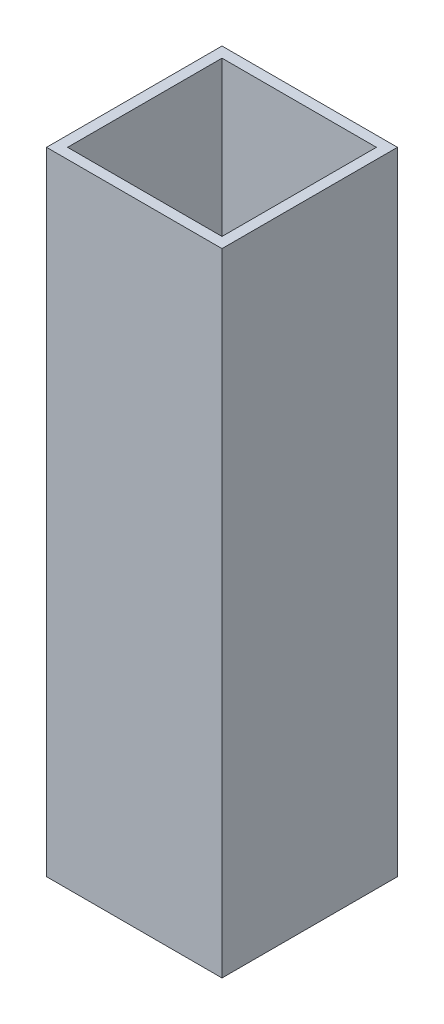
ISO-10303-21;
HEADER;
FILE_DESCRIPTION(('STEP AP214'),'2;1');
FILE_NAME('part.step','',(''),(''),'','','');
FILE_SCHEMA(('AUTOMOTIVE_DESIGN { 1 0 10303 214 1 1 1 1 }'));
ENDSEC;
DATA;
#1=APPLICATION_CONTEXT('core data for automotive mechanical design processes');
#2=APPLICATION_PROTOCOL_DEFINITION('international standard','automotive_design',2000,#1);
#3=PRODUCT_CONTEXT('',#1,'mechanical');
#4=PRODUCT('Part','Part','',(#3));
#5=PRODUCT_RELATED_PRODUCT_CATEGORY('part','',(#4));
#6=PRODUCT_DEFINITION_FORMATION('','',#4);
#7=PRODUCT_DEFINITION_CONTEXT('part definition',#1,'design');
#8=PRODUCT_DEFINITION('design','',#6,#7);
#9=PRODUCT_DEFINITION_SHAPE('','',#8);
#10=(LENGTH_UNIT() NAMED_UNIT(*) SI_UNIT(.MILLI.,.METRE.));
#11=(NAMED_UNIT(*) PLANE_ANGLE_UNIT() SI_UNIT($,.RADIAN.));
#12=(NAMED_UNIT(*) SI_UNIT($,.STERADIAN.) SOLID_ANGLE_UNIT());
#13=UNCERTAINTY_MEASURE_WITH_UNIT(LENGTH_MEASURE(1.E-05),#10,'distance_accuracy_value','');
#14=(GEOMETRIC_REPRESENTATION_CONTEXT(3) GLOBAL_UNCERTAINTY_ASSIGNED_CONTEXT((#13)) GLOBAL_UNIT_ASSIGNED_CONTEXT((#10,
#11,#12)) REPRESENTATION_CONTEXT('',''));
#15=CARTESIAN_POINT('',(0.,0.,0.));
#16=DIRECTION('',(0.,0.,1.));
#17=DIRECTION('',(1.,0.,0.));
#18=AXIS2_PLACEMENT_3D('',#15,#16,#17);
#19=CARTESIAN_POINT('',(-21.0084033613445,45.,-3.09873949579832));
#20=DIRECTION('',(1.,0.,0.));
#21=DIRECTION('',(0.,0.,-1.));
#22=AXIS2_PLACEMENT_3D('',#19,#20,#21);
#23=PLANE('',#22);
#24=DIRECTION('',(0.,0.,1.));
#25=VECTOR('',#24,1.);
#26=CARTESIAN_POINT('',(-21.0084033613445,0.,-3.09873949579832));
#27=LINE('',#26,#25);
#28=CARTESIAN_POINT('',(-21.0084033613445,0.,-3.09873949579832));
#29=VERTEX_POINT('',#28);
#30=CARTESIAN_POINT('',(-21.0084033613445,0.,9.40126050420168));
#31=VERTEX_POINT('',#30);
#32=EDGE_CURVE('E142',#29,#31,#27,.T.);
#33=ORIENTED_EDGE('',*,*,#32,.T.);
#34=DIRECTION('',(0.,-1.,0.));
#35=VECTOR('',#34,1.);
#36=CARTESIAN_POINT('',(-21.0084033613445,45.,9.40126050420168));
#37=LINE('',#36,#35);
#38=CARTESIAN_POINT('',(-21.0084033613445,45.,9.40126050420168));
#39=VERTEX_POINT('',#38);
#40=EDGE_CURVE('E11',#39,#31,#37,.T.);
#41=ORIENTED_EDGE('',*,*,#40,.F.);
#42=DIRECTION('',(0.,0.,1.));
#43=VECTOR('',#42,1.);
#44=CARTESIAN_POINT('',(-21.0084033613445,45.,-3.09873949579832));
#45=LINE('',#44,#43);
#46=CARTESIAN_POINT('',(-21.0084033613445,45.,-3.09873949579832));
#47=VERTEX_POINT('',#46);
#48=EDGE_CURVE('E146',#47,#39,#45,.T.);
#49=ORIENTED_EDGE('',*,*,#48,.F.);
#50=DIRECTION('',(0.,-1.,0.));
#51=VECTOR('',#50,1.);
#52=CARTESIAN_POINT('',(-21.0084033613445,45.,-3.09873949579832));
#53=LINE('',#52,#51);
#54=EDGE_CURVE('E152',#47,#29,#53,.T.);
#55=ORIENTED_EDGE('',*,*,#54,.T.);
#56=EDGE_LOOP('',(#33,#41,#49,#55));
#57=FACE_BOUND('',#56,.T.);
#58=ADVANCED_FACE('F34',(#57),#23,.F.);
#59=CARTESIAN_POINT('',(-21.0084033613445,45.,9.40126050420168));
#60=DIRECTION('',(0.,0.,-1.));
#61=DIRECTION('',(-1.,0.,0.));
#62=AXIS2_PLACEMENT_3D('',#59,#60,#61);
#63=PLANE('',#62);
#64=DIRECTION('',(1.,0.,0.));
#65=VECTOR('',#64,1.);
#66=CARTESIAN_POINT('',(-21.0084033613445,0.,9.40126050420168));
#67=LINE('',#66,#65);
#68=CARTESIAN_POINT('',(-8.50840336134454,0.,9.40126050420168));
#69=VERTEX_POINT('',#68);
#70=EDGE_CURVE('E155',#31,#69,#67,.T.);
#71=ORIENTED_EDGE('',*,*,#70,.T.);
#72=DIRECTION('',(0.,-1.,0.));
#73=VECTOR('',#72,1.);
#74=CARTESIAN_POINT('',(-8.50840336134454,45.,9.40126050420168));
#75=LINE('',#74,#73);
#76=CARTESIAN_POINT('',(-8.50840336134454,45.,9.40126050420168));
#77=VERTEX_POINT('',#76);
#78=EDGE_CURVE('E41',#77,#69,#75,.T.);
#79=ORIENTED_EDGE('',*,*,#78,.F.);
#80=DIRECTION('',(1.,0.,0.));
#81=VECTOR('',#80,1.);
#82=CARTESIAN_POINT('',(-21.0084033613445,45.,9.40126050420168));
#83=LINE('',#82,#81);
#84=EDGE_CURVE('E85',#39,#77,#83,.T.);
#85=ORIENTED_EDGE('',*,*,#84,.F.);
#86=ORIENTED_EDGE('',*,*,#40,.T.);
#87=EDGE_LOOP('',(#71,#79,#85,#86));
#88=FACE_BOUND('',#87,.T.);
#89=ADVANCED_FACE('F184',(#88),#63,.F.);
#90=CARTESIAN_POINT('',(-8.50840336134454,45.,-3.09873949579832));
#91=DIRECTION('',(-1.,0.,0.));
#92=DIRECTION('',(0.,0.,1.));
#93=AXIS2_PLACEMENT_3D('',#90,#91,#92);
#94=PLANE('',#93);
#95=DIRECTION('',(0.,0.,-1.));
#96=VECTOR('',#95,1.);
#97=CARTESIAN_POINT('',(-8.50840336134454,0.,-3.09873949579832));
#98=LINE('',#97,#96);
#99=CARTESIAN_POINT('',(-8.50840336134454,0.,-3.09873949579832));
#100=VERTEX_POINT('',#99);
#101=EDGE_CURVE('E157',#69,#100,#98,.T.);
#102=ORIENTED_EDGE('',*,*,#101,.T.);
#103=DIRECTION('',(0.,-1.,0.));
#104=VECTOR('',#103,1.);
#105=CARTESIAN_POINT('',(-8.50840336134454,45.,-3.09873949579832));
#106=LINE('',#105,#104);
#107=CARTESIAN_POINT('',(-8.50840336134454,45.,-3.09873949579832));
#108=VERTEX_POINT('',#107);
#109=EDGE_CURVE('E161',#108,#100,#106,.T.);
#110=ORIENTED_EDGE('',*,*,#109,.F.);
#111=DIRECTION('',(0.,0.,-1.));
#112=VECTOR('',#111,1.);
#113=CARTESIAN_POINT('',(-8.50840336134454,45.,-3.09873949579832));
#114=LINE('',#113,#112);
#115=EDGE_CURVE('E149',#77,#108,#114,.T.);
#116=ORIENTED_EDGE('',*,*,#115,.F.);
#117=ORIENTED_EDGE('',*,*,#78,.T.);
#118=EDGE_LOOP('',(#102,#110,#116,#117));
#119=FACE_BOUND('',#118,.T.);
#120=ADVANCED_FACE('F166',(#119),#94,.F.);
#121=CARTESIAN_POINT('',(-21.0084033613445,45.,-3.09873949579832));
#122=DIRECTION('',(0.,0.,1.));
#123=DIRECTION('',(1.,0.,0.));
#124=AXIS2_PLACEMENT_3D('',#121,#122,#123);
#125=PLANE('',#124);
#126=DIRECTION('',(-1.,0.,0.));
#127=VECTOR('',#126,1.);
#128=CARTESIAN_POINT('',(-21.0084033613445,0.,-3.09873949579832));
#129=LINE('',#128,#127);
#130=EDGE_CURVE('E78',#100,#29,#129,.T.);
#131=ORIENTED_EDGE('',*,*,#130,.T.);
#132=ORIENTED_EDGE('',*,*,#54,.F.);
#133=DIRECTION('',(-1.,0.,0.));
#134=VECTOR('',#133,1.);
#135=CARTESIAN_POINT('',(-21.0084033613445,45.,-3.09873949579832));
#136=LINE('',#135,#134);
#137=EDGE_CURVE('E57',#108,#47,#136,.T.);
#138=ORIENTED_EDGE('',*,*,#137,.F.);
#139=ORIENTED_EDGE('',*,*,#109,.T.);
#140=EDGE_LOOP('',(#131,#132,#138,#139));
#141=FACE_BOUND('',#140,.T.);
#142=ADVANCED_FACE('F174',(#141),#125,.F.);
#143=CARTESIAN_POINT('',(0.,45.,0.));
#144=DIRECTION('',(0.,1.,0.));
#145=DIRECTION('',(0.,0.,1.));
#146=AXIS2_PLACEMENT_3D('',#143,#144,#145);
#147=PLANE('',#146);
#148=DIRECTION('',(0.,0.,1.));
#149=VECTOR('',#148,1.);
#150=CARTESIAN_POINT('',(-20.2584033613445,45.,-2.34873949579832));
#151=LINE('',#150,#149);
#152=CARTESIAN_POINT('',(-20.2584033613445,45.,-2.34873949579832));
#153=VERTEX_POINT('',#152);
#154=CARTESIAN_POINT('',(-20.2584033613445,45.,8.65126050420168));
#155=VERTEX_POINT('',#154);
#156=EDGE_CURVE('E48',#153,#155,#151,.T.);
#157=ORIENTED_EDGE('',*,*,#156,.F.);
#158=DIRECTION('',(-1.,0.,0.));
#159=VECTOR('',#158,1.);
#160=CARTESIAN_POINT('',(-20.2584033613445,45.,-2.34873949579832));
#161=LINE('',#160,#159);
#162=CARTESIAN_POINT('',(-9.25840336134454,45.,-2.34873949579832));
#163=VERTEX_POINT('',#162);
#164=EDGE_CURVE('E127',#163,#153,#161,.T.);
#165=ORIENTED_EDGE('',*,*,#164,.F.);
#166=DIRECTION('',(0.,0.,-1.));
#167=VECTOR('',#166,1.);
#168=CARTESIAN_POINT('',(-9.25840336134454,45.,-2.34873949579832));
#169=LINE('',#168,#167);
#170=CARTESIAN_POINT('',(-9.25840336134454,45.,8.65126050420168));
#171=VERTEX_POINT('',#170);
#172=EDGE_CURVE('E130',#171,#163,#169,.T.);
#173=ORIENTED_EDGE('',*,*,#172,.F.);
#174=DIRECTION('',(1.,0.,0.));
#175=VECTOR('',#174,1.);
#176=CARTESIAN_POINT('',(-20.2584033613445,45.,8.65126050420168));
#177=LINE('',#176,#175);
#178=EDGE_CURVE('E136',#155,#171,#177,.T.);
#179=ORIENTED_EDGE('',*,*,#178,.F.);
#180=EDGE_LOOP('',(#157,#165,#173,#179));
#181=FACE_BOUND('',#180,.T.);
#182=ORIENTED_EDGE('',*,*,#48,.T.);
#183=ORIENTED_EDGE('',*,*,#84,.T.);
#184=ORIENTED_EDGE('',*,*,#115,.T.);
#185=ORIENTED_EDGE('',*,*,#137,.T.);
#186=EDGE_LOOP('',(#182,#183,#184,#185));
#187=FACE_BOUND('',#186,.T.);
#188=ADVANCED_FACE('F176',(#181,#187),#147,.T.);
#189=CARTESIAN_POINT('',(0.,0.,0.));
#190=DIRECTION('',(0.,1.,0.));
#191=DIRECTION('',(0.,0.,1.));
#192=AXIS2_PLACEMENT_3D('',#189,#190,#191);
#193=PLANE('',#192);
#194=ORIENTED_EDGE('',*,*,#32,.F.);
#195=ORIENTED_EDGE('',*,*,#130,.F.);
#196=ORIENTED_EDGE('',*,*,#101,.F.);
#197=ORIENTED_EDGE('',*,*,#70,.F.);
#198=EDGE_LOOP('',(#194,#195,#196,#197));
#199=FACE_BOUND('',#198,.T.);
#200=ADVANCED_FACE('F170',(#199),#193,.F.);
#201=CARTESIAN_POINT('',(-20.2584033613445,0.999999999999994,-2.34873949579832));
#202=DIRECTION('',(-1.,0.,0.));
#203=DIRECTION('',(0.,0.,1.));
#204=AXIS2_PLACEMENT_3D('',#201,#202,#203);
#205=PLANE('',#204);
#206=ORIENTED_EDGE('',*,*,#156,.T.);
#207=DIRECTION('',(0.,1.,0.));
#208=VECTOR('',#207,1.);
#209=CARTESIAN_POINT('',(-20.2584033613445,0.999999999999994,8.65126050420168));
#210=LINE('',#209,#208);
#211=CARTESIAN_POINT('',(-20.2584033613445,0.999999999999994,8.65126050420168));
#212=VERTEX_POINT('',#211);
#213=EDGE_CURVE('E105',#212,#155,#210,.T.);
#214=ORIENTED_EDGE('',*,*,#213,.F.);
#215=DIRECTION('',(0.,0.,1.));
#216=VECTOR('',#215,1.);
#217=CARTESIAN_POINT('',(-20.2584033613445,0.999999999999994,-2.34873949579832));
#218=LINE('',#217,#216);
#219=CARTESIAN_POINT('',(-20.2584033613445,0.999999999999994,-2.34873949579832));
#220=VERTEX_POINT('',#219);
#221=EDGE_CURVE('E109',#220,#212,#218,.T.);
#222=ORIENTED_EDGE('',*,*,#221,.F.);
#223=DIRECTION('',(0.,1.,0.));
#224=VECTOR('',#223,1.);
#225=CARTESIAN_POINT('',(-20.2584033613445,0.999999999999994,-2.34873949579832));
#226=LINE('',#225,#224);
#227=EDGE_CURVE('E140',#220,#153,#226,.T.);
#228=ORIENTED_EDGE('',*,*,#227,.T.);
#229=EDGE_LOOP('',(#206,#214,#222,#228));
#230=FACE_BOUND('',#229,.T.);
#231=ADVANCED_FACE('F107',(#230),#205,.F.);
#232=CARTESIAN_POINT('',(-20.2584033613445,0.999999999999994,-2.34873949579832));
#233=DIRECTION('',(0.,0.,-1.));
#234=DIRECTION('',(-1.,0.,0.));
#235=AXIS2_PLACEMENT_3D('',#232,#233,#234);
#236=PLANE('',#235);
#237=ORIENTED_EDGE('',*,*,#164,.T.);
#238=ORIENTED_EDGE('',*,*,#227,.F.);
#239=DIRECTION('',(-1.,0.,0.));
#240=VECTOR('',#239,1.);
#241=CARTESIAN_POINT('',(-20.2584033613445,0.999999999999994,-2.34873949579832));
#242=LINE('',#241,#240);
#243=CARTESIAN_POINT('',(-9.25840336134454,0.999999999999994,-2.34873949579832));
#244=VERTEX_POINT('',#243);
#245=EDGE_CURVE('E115',#244,#220,#242,.T.);
#246=ORIENTED_EDGE('',*,*,#245,.F.);
#247=DIRECTION('',(0.,1.,0.));
#248=VECTOR('',#247,1.);
#249=CARTESIAN_POINT('',(-9.25840336134454,0.999999999999994,-2.34873949579832));
#250=LINE('',#249,#248);
#251=EDGE_CURVE('E143',#244,#163,#250,.T.);
#252=ORIENTED_EDGE('',*,*,#251,.T.);
#253=EDGE_LOOP('',(#237,#238,#246,#252));
#254=FACE_BOUND('',#253,.T.);
#255=ADVANCED_FACE('F223',(#254),#236,.F.);
#256=CARTESIAN_POINT('',(-9.25840336134454,0.999999999999994,-2.34873949579832));
#257=DIRECTION('',(1.,0.,0.));
#258=DIRECTION('',(0.,0.,-1.));
#259=AXIS2_PLACEMENT_3D('',#256,#257,#258);
#260=PLANE('',#259);
#261=ORIENTED_EDGE('',*,*,#172,.T.);
#262=ORIENTED_EDGE('',*,*,#251,.F.);
#263=DIRECTION('',(0.,0.,-1.));
#264=VECTOR('',#263,1.);
#265=CARTESIAN_POINT('',(-9.25840336134454,0.999999999999994,-2.34873949579832));
#266=LINE('',#265,#264);
#267=CARTESIAN_POINT('',(-9.25840336134454,0.999999999999994,8.65126050420168));
#268=VERTEX_POINT('',#267);
#269=EDGE_CURVE('E123',#268,#244,#266,.T.);
#270=ORIENTED_EDGE('',*,*,#269,.F.);
#271=DIRECTION('',(0.,1.,0.));
#272=VECTOR('',#271,1.);
#273=CARTESIAN_POINT('',(-9.25840336134454,0.999999999999994,8.65126050420168));
#274=LINE('',#273,#272);
#275=EDGE_CURVE('E114',#268,#171,#274,.T.);
#276=ORIENTED_EDGE('',*,*,#275,.T.);
#277=EDGE_LOOP('',(#261,#262,#270,#276));
#278=FACE_BOUND('',#277,.T.);
#279=ADVANCED_FACE('F232',(#278),#260,.F.);
#280=CARTESIAN_POINT('',(-20.2584033613445,0.999999999999994,8.65126050420168));
#281=DIRECTION('',(0.,0.,1.));
#282=DIRECTION('',(1.,0.,0.));
#283=AXIS2_PLACEMENT_3D('',#280,#281,#282);
#284=PLANE('',#283);
#285=ORIENTED_EDGE('',*,*,#178,.T.);
#286=ORIENTED_EDGE('',*,*,#275,.F.);
#287=DIRECTION('',(1.,0.,0.));
#288=VECTOR('',#287,1.);
#289=CARTESIAN_POINT('',(-20.2584033613445,0.999999999999994,8.65126050420168));
#290=LINE('',#289,#288);
#291=EDGE_CURVE('E118',#212,#268,#290,.T.);
#292=ORIENTED_EDGE('',*,*,#291,.F.);
#293=ORIENTED_EDGE('',*,*,#213,.T.);
#294=EDGE_LOOP('',(#285,#286,#292,#293));
#295=FACE_BOUND('',#294,.T.);
#296=ADVANCED_FACE('F119',(#295),#284,.F.);
#297=CARTESIAN_POINT('',(0.,0.999999999999994,0.));
#298=DIRECTION('',(0.,1.,0.));
#299=DIRECTION('',(0.,0.,1.));
#300=AXIS2_PLACEMENT_3D('',#297,#298,#299);
#301=PLANE('',#300);
#302=ORIENTED_EDGE('',*,*,#221,.T.);
#303=ORIENTED_EDGE('',*,*,#291,.T.);
#304=ORIENTED_EDGE('',*,*,#269,.T.);
#305=ORIENTED_EDGE('',*,*,#245,.T.);
#306=EDGE_LOOP('',(#302,#303,#304,#305));
#307=FACE_BOUND('',#306,.T.);
#308=ADVANCED_FACE('F125',(#307),#301,.T.);
#309=CLOSED_SHELL('',(#58,#89,#120,#142,#188,#200,#231,#255,#279,#296,#308));
#310=MANIFOLD_SOLID_BREP('B2',#309);
#311=ADVANCED_BREP_SHAPE_REPRESENTATION('',(#18,#310),#14);
#312=SHAPE_DEFINITION_REPRESENTATION(#9,#311);
ENDSEC;
END-ISO-10303-21;
